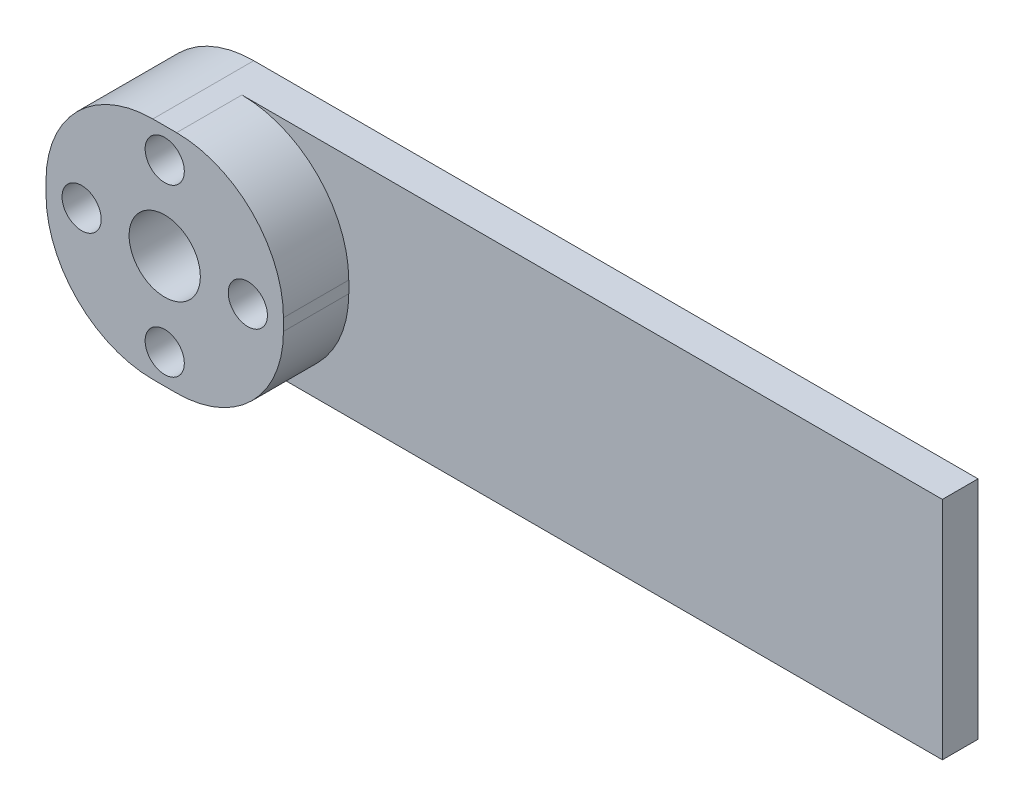
ISO-10303-21;
HEADER;
FILE_DESCRIPTION(('STEP AP214'),'2;1');
FILE_NAME('part.step','',(''),(''),'','','');
FILE_SCHEMA(('AUTOMOTIVE_DESIGN { 1 0 10303 214 1 1 1 1 }'));
ENDSEC;
DATA;
#1=APPLICATION_CONTEXT('core data for automotive mechanical design processes');
#2=APPLICATION_PROTOCOL_DEFINITION('international standard','automotive_design',2000,#1);
#3=PRODUCT_CONTEXT('',#1,'mechanical');
#4=PRODUCT('Part','Part','',(#3));
#5=PRODUCT_RELATED_PRODUCT_CATEGORY('part','',(#4));
#6=PRODUCT_DEFINITION_FORMATION('','',#4);
#7=PRODUCT_DEFINITION_CONTEXT('part definition',#1,'design');
#8=PRODUCT_DEFINITION('design','',#6,#7);
#9=PRODUCT_DEFINITION_SHAPE('','',#8);
#10=(LENGTH_UNIT() NAMED_UNIT(*) SI_UNIT(.MILLI.,.METRE.));
#11=(NAMED_UNIT(*) PLANE_ANGLE_UNIT() SI_UNIT($,.RADIAN.));
#12=(NAMED_UNIT(*) SI_UNIT($,.STERADIAN.) SOLID_ANGLE_UNIT());
#13=UNCERTAINTY_MEASURE_WITH_UNIT(LENGTH_MEASURE(1.E-05),#10,'distance_accuracy_value','');
#14=(GEOMETRIC_REPRESENTATION_CONTEXT(3) GLOBAL_UNCERTAINTY_ASSIGNED_CONTEXT((#13)) GLOBAL_UNIT_ASSIGNED_CONTEXT((#10,
#11,#12)) REPRESENTATION_CONTEXT('',''));
#15=CARTESIAN_POINT('',(0.,0.,0.));
#16=DIRECTION('',(0.,0.,1.));
#17=DIRECTION('',(1.,0.,0.));
#18=AXIS2_PLACEMENT_3D('',#15,#16,#17);
#19=CARTESIAN_POINT('',(0.,9.5,3.));
#20=DIRECTION('',(0.,1.,0.));
#21=DIRECTION('',(0.,0.,1.));
#22=AXIS2_PLACEMENT_3D('',#19,#20,#21);
#23=PLANE('',#22);
#24=DIRECTION('',(-1.,0.,0.));
#25=VECTOR('',#24,1.);
#26=CARTESIAN_POINT('',(-0.999999999999999,9.5,8.5));
#27=LINE('',#26,#25);
#28=CARTESIAN_POINT('',(0.999999999999999,9.5,8.5));
#29=VERTEX_POINT('',#28);
#30=CARTESIAN_POINT('',(-0.999999999999999,9.5,8.5));
#31=VERTEX_POINT('',#30);
#32=EDGE_CURVE('E153',#29,#31,#27,.T.);
#33=ORIENTED_EDGE('',*,*,#32,.F.);
#34=DIRECTION('',(0.,0.,-1.));
#35=VECTOR('',#34,1.);
#36=CARTESIAN_POINT('',(0.999999999999999,9.5,3.));
#37=LINE('',#36,#35);
#38=CARTESIAN_POINT('',(0.999999999999999,9.5,3.));
#39=VERTEX_POINT('',#38);
#40=EDGE_CURVE('E213',#29,#39,#37,.T.);
#41=ORIENTED_EDGE('',*,*,#40,.T.);
#42=DIRECTION('',(1.,0.,0.));
#43=VECTOR('',#42,1.);
#44=CARTESIAN_POINT('',(0.,9.5,3.));
#45=LINE('',#44,#43);
#46=CARTESIAN_POINT('',(60.,9.5,3.));
#47=VERTEX_POINT('',#46);
#48=EDGE_CURVE('E55',#39,#47,#45,.T.);
#49=ORIENTED_EDGE('',*,*,#48,.T.);
#50=DIRECTION('',(0.,0.,-1.));
#51=VECTOR('',#50,1.);
#52=CARTESIAN_POINT('',(60.,9.5,3.));
#53=LINE('',#52,#51);
#54=CARTESIAN_POINT('',(60.,9.5,0.));
#55=VERTEX_POINT('',#54);
#56=EDGE_CURVE('E169',#47,#55,#53,.T.);
#57=ORIENTED_EDGE('',*,*,#56,.T.);
#58=DIRECTION('',(1.,0.,0.));
#59=VECTOR('',#58,1.);
#60=CARTESIAN_POINT('',(0.,9.5,0.));
#61=LINE('',#60,#59);
#62=CARTESIAN_POINT('',(-0.999999999999999,9.5,0.));
#63=VERTEX_POINT('',#62);
#64=EDGE_CURVE('E161',#63,#55,#61,.T.);
#65=ORIENTED_EDGE('',*,*,#64,.F.);
#66=DIRECTION('',(0.,0.,-1.));
#67=VECTOR('',#66,1.);
#68=CARTESIAN_POINT('',(-0.999999999999999,9.5,3.));
#69=LINE('',#68,#67);
#70=EDGE_CURVE('E201',#63,#31,#69,.F.);
#71=ORIENTED_EDGE('',*,*,#70,.T.);
#72=EDGE_LOOP('',(#33,#41,#49,#57,#65,#71));
#73=FACE_BOUND('',#72,.T.);
#74=ADVANCED_FACE('F41',(#73),#23,.T.);
#75=CARTESIAN_POINT('',(-10.,0.,3.));
#76=DIRECTION('',(1.,0.,0.));
#77=DIRECTION('',(0.,0.,-1.));
#78=AXIS2_PLACEMENT_3D('',#75,#76,#77);
#79=PLANE('',#78);
#80=DIRECTION('',(0.,-1.,0.));
#81=VECTOR('',#80,1.);
#82=CARTESIAN_POINT('',(-10.,0.,0.));
#83=LINE('',#82,#81);
#84=CARTESIAN_POINT('',(-10.,0.5,0.));
#85=VERTEX_POINT('',#84);
#86=CARTESIAN_POINT('',(-10.,-0.5,0.));
#87=VERTEX_POINT('',#86);
#88=EDGE_CURVE('E171',#85,#87,#83,.T.);
#89=ORIENTED_EDGE('',*,*,#88,.T.);
#90=DIRECTION('',(0.,0.,-1.));
#91=VECTOR('',#90,1.);
#92=CARTESIAN_POINT('',(-10.,-0.5,3.));
#93=LINE('',#92,#91);
#94=CARTESIAN_POINT('',(-10.,-0.5,8.5));
#95=VERTEX_POINT('',#94);
#96=EDGE_CURVE('E199',#87,#95,#93,.F.);
#97=ORIENTED_EDGE('',*,*,#96,.T.);
#98=DIRECTION('',(0.,-1.,0.));
#99=VECTOR('',#98,1.);
#100=CARTESIAN_POINT('',(-10.,0.5,8.5));
#101=LINE('',#100,#99);
#102=CARTESIAN_POINT('',(-10.,0.5,8.5));
#103=VERTEX_POINT('',#102);
#104=EDGE_CURVE('E143',#103,#95,#101,.T.);
#105=ORIENTED_EDGE('',*,*,#104,.F.);
#106=DIRECTION('',(0.,0.,-1.));
#107=VECTOR('',#106,1.);
#108=CARTESIAN_POINT('',(-10.,0.5,0.));
#109=LINE('',#108,#107);
#110=EDGE_CURVE('E196',#103,#85,#109,.T.);
#111=ORIENTED_EDGE('',*,*,#110,.T.);
#112=EDGE_LOOP('',(#89,#97,#105,#111));
#113=FACE_BOUND('',#112,.T.);
#114=ADVANCED_FACE('F235',(#113),#79,.F.);
#115=CARTESIAN_POINT('',(0.,-9.5,3.));
#116=DIRECTION('',(0.,1.,0.));
#117=DIRECTION('',(0.,0.,1.));
#118=AXIS2_PLACEMENT_3D('',#115,#116,#117);
#119=PLANE('',#118);
#120=DIRECTION('',(1.,0.,0.));
#121=VECTOR('',#120,1.);
#122=CARTESIAN_POINT('',(0.,-9.5,3.));
#123=LINE('',#122,#121);
#124=CARTESIAN_POINT('',(0.999999999999999,-9.5,3.));
#125=VERTEX_POINT('',#124);
#126=CARTESIAN_POINT('',(60.,-9.5,3.));
#127=VERTEX_POINT('',#126);
#128=EDGE_CURVE('E163',#125,#127,#123,.T.);
#129=ORIENTED_EDGE('',*,*,#128,.F.);
#130=DIRECTION('',(0.,0.,-1.));
#131=VECTOR('',#130,1.);
#132=CARTESIAN_POINT('',(0.999999999999999,-9.5,3.));
#133=LINE('',#132,#131);
#134=CARTESIAN_POINT('',(0.999999999999999,-9.5,8.5));
#135=VERTEX_POINT('',#134);
#136=EDGE_CURVE('E134',#125,#135,#133,.F.);
#137=ORIENTED_EDGE('',*,*,#136,.T.);
#138=DIRECTION('',(1.,0.,0.));
#139=VECTOR('',#138,1.);
#140=CARTESIAN_POINT('',(10.,-9.5,8.5));
#141=LINE('',#140,#139);
#142=CARTESIAN_POINT('',(-0.999999999999999,-9.5,8.5));
#143=VERTEX_POINT('',#142);
#144=EDGE_CURVE('E131',#143,#135,#141,.T.);
#145=ORIENTED_EDGE('',*,*,#144,.F.);
#146=DIRECTION('',(0.,0.,-1.));
#147=VECTOR('',#146,1.);
#148=CARTESIAN_POINT('',(-0.999999999999999,-9.5,3.));
#149=LINE('',#148,#147);
#150=CARTESIAN_POINT('',(-0.999999999999999,-9.5,0.));
#151=VERTEX_POINT('',#150);
#152=EDGE_CURVE('E118',#143,#151,#149,.T.);
#153=ORIENTED_EDGE('',*,*,#152,.T.);
#154=DIRECTION('',(1.,0.,0.));
#155=VECTOR('',#154,1.);
#156=CARTESIAN_POINT('',(0.,-9.5,0.));
#157=LINE('',#156,#155);
#158=CARTESIAN_POINT('',(60.,-9.5,0.));
#159=VERTEX_POINT('',#158);
#160=EDGE_CURVE('E174',#151,#159,#157,.T.);
#161=ORIENTED_EDGE('',*,*,#160,.T.);
#162=DIRECTION('',(0.,0.,-1.));
#163=VECTOR('',#162,1.);
#164=CARTESIAN_POINT('',(60.,-9.5,3.));
#165=LINE('',#164,#163);
#166=EDGE_CURVE('E128',#127,#159,#165,.T.);
#167=ORIENTED_EDGE('',*,*,#166,.F.);
#168=EDGE_LOOP('',(#129,#137,#145,#153,#161,#167));
#169=FACE_BOUND('',#168,.T.);
#170=ADVANCED_FACE('F132',(#169),#119,.F.);
#171=CARTESIAN_POINT('',(7.,0.,3.));
#172=DIRECTION('',(0.,0.,-1.));
#173=DIRECTION('',(-1.,0.,0.));
#174=AXIS2_PLACEMENT_3D('',#171,#172,#173);
#175=CYLINDRICAL_SURFACE('',#174,1.65);
#176=CARTESIAN_POINT('',(7.,0.,0.));
#177=DIRECTION('',(0.,0.,1.));
#178=DIRECTION('',(1.,0.,0.));
#179=AXIS2_PLACEMENT_3D('',#176,#177,#178);
#180=CIRCLE('',#179,1.65);
#181=CARTESIAN_POINT('',(8.65,0.,0.));
#182=VERTEX_POINT('',#181);
#183=EDGE_CURVE('E185',#182,#182,#180,.T.);
#184=ORIENTED_EDGE('',*,*,#183,.F.);
#185=EDGE_LOOP('',(#184));
#186=FACE_BOUND('',#185,.T.);
#187=CARTESIAN_POINT('',(7.,0.,8.5));
#188=DIRECTION('',(0.,0.,1.));
#189=DIRECTION('',(1.,0.,0.));
#190=AXIS2_PLACEMENT_3D('',#187,#188,#189);
#191=CIRCLE('',#190,1.65);
#192=CARTESIAN_POINT('',(8.65,0.,8.5));
#193=VERTEX_POINT('',#192);
#194=EDGE_CURVE('E512',#193,#193,#191,.T.);
#195=ORIENTED_EDGE('',*,*,#194,.T.);
#196=EDGE_LOOP('',(#195));
#197=FACE_BOUND('',#196,.T.);
#198=ADVANCED_FACE('F264',(#186,#197),#175,.F.);
#199=CARTESIAN_POINT('',(0.,-7.,3.));
#200=DIRECTION('',(0.,0.,-1.));
#201=DIRECTION('',(-1.,0.,0.));
#202=AXIS2_PLACEMENT_3D('',#199,#200,#201);
#203=CYLINDRICAL_SURFACE('',#202,1.65);
#204=CARTESIAN_POINT('',(0.,-7.,0.));
#205=DIRECTION('',(0.,0.,1.));
#206=DIRECTION('',(1.,0.,0.));
#207=AXIS2_PLACEMENT_3D('',#204,#205,#206);
#208=CIRCLE('',#207,1.65);
#209=CARTESIAN_POINT('',(1.65,-7.,0.));
#210=VERTEX_POINT('',#209);
#211=EDGE_CURVE('E182',#210,#210,#208,.T.);
#212=ORIENTED_EDGE('',*,*,#211,.F.);
#213=EDGE_LOOP('',(#212));
#214=FACE_BOUND('',#213,.T.);
#215=CARTESIAN_POINT('',(0.,-7.,8.5));
#216=DIRECTION('',(0.,0.,1.));
#217=DIRECTION('',(1.,0.,0.));
#218=AXIS2_PLACEMENT_3D('',#215,#216,#217);
#219=CIRCLE('',#218,1.65);
#220=CARTESIAN_POINT('',(1.65,-7.,8.5));
#221=VERTEX_POINT('',#220);
#222=EDGE_CURVE('E511',#221,#221,#219,.T.);
#223=ORIENTED_EDGE('',*,*,#222,.T.);
#224=EDGE_LOOP('',(#223));
#225=FACE_BOUND('',#224,.T.);
#226=ADVANCED_FACE('F271',(#214,#225),#203,.F.);
#227=CARTESIAN_POINT('',(-7.,0.,3.));
#228=DIRECTION('',(0.,0.,-1.));
#229=DIRECTION('',(-1.,0.,0.));
#230=AXIS2_PLACEMENT_3D('',#227,#228,#229);
#231=CYLINDRICAL_SURFACE('',#230,1.65);
#232=CARTESIAN_POINT('',(-7.,0.,0.));
#233=DIRECTION('',(0.,0.,1.));
#234=DIRECTION('',(1.,0.,0.));
#235=AXIS2_PLACEMENT_3D('',#232,#233,#234);
#236=CIRCLE('',#235,1.65);
#237=CARTESIAN_POINT('',(-5.35,0.,0.));
#238=VERTEX_POINT('',#237);
#239=EDGE_CURVE('E179',#238,#238,#236,.T.);
#240=ORIENTED_EDGE('',*,*,#239,.F.);
#241=EDGE_LOOP('',(#240));
#242=FACE_BOUND('',#241,.T.);
#243=CARTESIAN_POINT('',(-7.,0.,8.5));
#244=DIRECTION('',(0.,0.,1.));
#245=DIRECTION('',(1.,0.,0.));
#246=AXIS2_PLACEMENT_3D('',#243,#244,#245);
#247=CIRCLE('',#246,1.65);
#248=CARTESIAN_POINT('',(-5.35,0.,8.5));
#249=VERTEX_POINT('',#248);
#250=EDGE_CURVE('E515',#249,#249,#247,.T.);
#251=ORIENTED_EDGE('',*,*,#250,.T.);
#252=EDGE_LOOP('',(#251));
#253=FACE_BOUND('',#252,.T.);
#254=ADVANCED_FACE('F268',(#242,#253),#231,.F.);
#255=CARTESIAN_POINT('',(60.,0.,3.));
#256=DIRECTION('',(1.,0.,0.));
#257=DIRECTION('',(0.,0.,-1.));
#258=AXIS2_PLACEMENT_3D('',#255,#256,#257);
#259=PLANE('',#258);
#260=DIRECTION('',(0.,-1.,0.));
#261=VECTOR('',#260,1.);
#262=CARTESIAN_POINT('',(60.,0.,0.));
#263=LINE('',#262,#261);
#264=EDGE_CURVE('E176',#55,#159,#263,.T.);
#265=ORIENTED_EDGE('',*,*,#264,.F.);
#266=ORIENTED_EDGE('',*,*,#56,.F.);
#267=DIRECTION('',(0.,-1.,0.));
#268=VECTOR('',#267,1.);
#269=CARTESIAN_POINT('',(60.,0.,3.));
#270=LINE('',#269,#268);
#271=EDGE_CURVE('E166',#47,#127,#270,.T.);
#272=ORIENTED_EDGE('',*,*,#271,.T.);
#273=ORIENTED_EDGE('',*,*,#166,.T.);
#274=EDGE_LOOP('',(#265,#266,#272,#273));
#275=FACE_BOUND('',#274,.T.);
#276=ADVANCED_FACE('F242',(#275),#259,.T.);
#277=CARTESIAN_POINT('',(0.,7.,3.));
#278=DIRECTION('',(0.,0.,-1.));
#279=DIRECTION('',(-1.,0.,0.));
#280=AXIS2_PLACEMENT_3D('',#277,#278,#279);
#281=CYLINDRICAL_SURFACE('',#280,1.65);
#282=CARTESIAN_POINT('',(0.,7.,0.));
#283=DIRECTION('',(0.,0.,1.));
#284=DIRECTION('',(1.,0.,0.));
#285=AXIS2_PLACEMENT_3D('',#282,#283,#284);
#286=CIRCLE('',#285,1.65);
#287=CARTESIAN_POINT('',(1.65,7.,0.));
#288=VERTEX_POINT('',#287);
#289=EDGE_CURVE('E164',#288,#288,#286,.T.);
#290=ORIENTED_EDGE('',*,*,#289,.F.);
#291=EDGE_LOOP('',(#290));
#292=FACE_BOUND('',#291,.T.);
#293=CARTESIAN_POINT('',(0.,7.,8.5));
#294=DIRECTION('',(0.,0.,1.));
#295=DIRECTION('',(1.,0.,0.));
#296=AXIS2_PLACEMENT_3D('',#293,#294,#295);
#297=CIRCLE('',#296,1.65);
#298=CARTESIAN_POINT('',(1.65,7.,8.5));
#299=VERTEX_POINT('',#298);
#300=EDGE_CURVE('E147',#299,#299,#297,.T.);
#301=ORIENTED_EDGE('',*,*,#300,.T.);
#302=EDGE_LOOP('',(#301));
#303=FACE_BOUND('',#302,.T.);
#304=ADVANCED_FACE('F267',(#292,#303),#281,.F.);
#305=CARTESIAN_POINT('',(0.,0.,3.));
#306=DIRECTION('',(0.,0.,1.));
#307=DIRECTION('',(1.,0.,0.));
#308=AXIS2_PLACEMENT_3D('',#305,#306,#307);
#309=PLANE('',#308);
#310=DIRECTION('',(0.,1.,0.));
#311=VECTOR('',#310,1.);
#312=CARTESIAN_POINT('',(10.,9.5,3.));
#313=LINE('',#312,#311);
#314=CARTESIAN_POINT('',(10.,-0.499999999999999,3.));
#315=VERTEX_POINT('',#314);
#316=CARTESIAN_POINT('',(10.,0.500000000000002,3.));
#317=VERTEX_POINT('',#316);
#318=EDGE_CURVE('E144',#315,#317,#313,.T.);
#319=ORIENTED_EDGE('',*,*,#318,.F.);
#320=CARTESIAN_POINT('',(0.999999999999999,-0.5,3.));
#321=DIRECTION('',(0.,0.,1.));
#322=DIRECTION('',(1.,0.,0.));
#323=AXIS2_PLACEMENT_3D('',#320,#321,#322);
#324=CIRCLE('',#323,9.);
#325=EDGE_CURVE('E49',#315,#125,#324,.F.);
#326=ORIENTED_EDGE('',*,*,#325,.T.);
#327=ORIENTED_EDGE('',*,*,#128,.T.);
#328=ORIENTED_EDGE('',*,*,#271,.F.);
#329=ORIENTED_EDGE('',*,*,#48,.F.);
#330=CARTESIAN_POINT('',(0.999999999999999,0.5,3.));
#331=DIRECTION('',(0.,0.,1.));
#332=DIRECTION('',(1.,0.,0.));
#333=AXIS2_PLACEMENT_3D('',#330,#331,#332);
#334=CIRCLE('',#333,9.);
#335=EDGE_CURVE('E11',#39,#317,#334,.F.);
#336=ORIENTED_EDGE('',*,*,#335,.T.);
#337=EDGE_LOOP('',(#319,#326,#327,#328,#329,#336));
#338=FACE_BOUND('',#337,.T.);
#339=ADVANCED_FACE('F217',(#338),#309,.T.);
#340=CARTESIAN_POINT('',(0.,0.,0.));
#341=DIRECTION('',(0.,0.,1.));
#342=DIRECTION('',(1.,0.,0.));
#343=AXIS2_PLACEMENT_3D('',#340,#341,#342);
#344=PLANE('',#343);
#345=CARTESIAN_POINT('',(0.,0.,0.));
#346=DIRECTION('',(0.,0.,1.));
#347=DIRECTION('',(1.,0.,0.));
#348=AXIS2_PLACEMENT_3D('',#345,#346,#347);
#349=CIRCLE('',#348,3.);
#350=CARTESIAN_POINT('',(3.,0.,0.));
#351=VERTEX_POINT('',#350);
#352=EDGE_CURVE('E157',#351,#351,#349,.T.);
#353=ORIENTED_EDGE('',*,*,#352,.T.);
#354=EDGE_LOOP('',(#353));
#355=FACE_BOUND('',#354,.T.);
#356=ORIENTED_EDGE('',*,*,#160,.F.);
#357=CARTESIAN_POINT('',(-0.999999999999999,-0.5,0.));
#358=DIRECTION('',(0.,0.,1.));
#359=DIRECTION('',(1.,0.,0.));
#360=AXIS2_PLACEMENT_3D('',#357,#358,#359);
#361=CIRCLE('',#360,9.);
#362=EDGE_CURVE('E124',#151,#87,#361,.F.);
#363=ORIENTED_EDGE('',*,*,#362,.T.);
#364=ORIENTED_EDGE('',*,*,#88,.F.);
#365=CARTESIAN_POINT('',(-0.999999999999999,0.5,0.));
#366=DIRECTION('',(0.,0.,1.));
#367=DIRECTION('',(1.,0.,0.));
#368=AXIS2_PLACEMENT_3D('',#365,#366,#367);
#369=CIRCLE('',#368,9.);
#370=EDGE_CURVE('E127',#85,#63,#369,.F.);
#371=ORIENTED_EDGE('',*,*,#370,.T.);
#372=ORIENTED_EDGE('',*,*,#64,.T.);
#373=ORIENTED_EDGE('',*,*,#264,.T.);
#374=EDGE_LOOP('',(#356,#363,#364,#371,#372,#373));
#375=FACE_BOUND('',#374,.T.);
#376=ORIENTED_EDGE('',*,*,#239,.T.);
#377=EDGE_LOOP('',(#376));
#378=FACE_BOUND('',#377,.T.);
#379=ORIENTED_EDGE('',*,*,#211,.T.);
#380=EDGE_LOOP('',(#379));
#381=FACE_BOUND('',#380,.T.);
#382=ORIENTED_EDGE('',*,*,#183,.T.);
#383=EDGE_LOOP('',(#382));
#384=FACE_BOUND('',#383,.T.);
#385=ORIENTED_EDGE('',*,*,#289,.T.);
#386=EDGE_LOOP('',(#385));
#387=FACE_BOUND('',#386,.T.);
#388=ADVANCED_FACE('F238',(#355,#375,#378,#381,#384,#387),#344,.F.);
#389=CARTESIAN_POINT('',(0.,0.,0.));
#390=DIRECTION('',(0.,0.,1.));
#391=DIRECTION('',(1.,0.,0.));
#392=AXIS2_PLACEMENT_3D('',#389,#390,#391);
#393=CYLINDRICAL_SURFACE('',#392,3.);
#394=ORIENTED_EDGE('',*,*,#352,.F.);
#395=EDGE_LOOP('',(#394));
#396=FACE_BOUND('',#395,.T.);
#397=CARTESIAN_POINT('',(0.,0.,8.5));
#398=DIRECTION('',(0.,0.,1.));
#399=DIRECTION('',(1.,0.,0.));
#400=AXIS2_PLACEMENT_3D('',#397,#398,#399);
#401=CIRCLE('',#400,3.);
#402=CARTESIAN_POINT('',(3.,0.,8.5));
#403=VERTEX_POINT('',#402);
#404=EDGE_CURVE('E510',#403,#403,#401,.T.);
#405=ORIENTED_EDGE('',*,*,#404,.T.);
#406=EDGE_LOOP('',(#405));
#407=FACE_BOUND('',#406,.T.);
#408=ADVANCED_FACE('F252',(#396,#407),#393,.F.);
#409=CARTESIAN_POINT('',(-0.999999999999999,-0.5,3.));
#410=DIRECTION('',(0.,0.,-1.));
#411=DIRECTION('',(-1.,0.,0.));
#412=AXIS2_PLACEMENT_3D('',#409,#410,#411);
#413=CYLINDRICAL_SURFACE('',#412,9.);
#414=ORIENTED_EDGE('',*,*,#152,.F.);
#415=CARTESIAN_POINT('',(-0.999999999999999,-0.5,8.5));
#416=DIRECTION('',(0.,0.,1.));
#417=DIRECTION('',(1.,0.,0.));
#418=AXIS2_PLACEMENT_3D('',#415,#416,#417);
#419=CIRCLE('',#418,9.);
#420=EDGE_CURVE('E123',#95,#143,#419,.T.);
#421=ORIENTED_EDGE('',*,*,#420,.F.);
#422=ORIENTED_EDGE('',*,*,#96,.F.);
#423=ORIENTED_EDGE('',*,*,#362,.F.);
#424=EDGE_LOOP('',(#414,#421,#422,#423));
#425=FACE_BOUND('',#424,.T.);
#426=ADVANCED_FACE('F120',(#425),#413,.T.);
#427=CARTESIAN_POINT('',(-0.999999999999999,0.5,3.));
#428=DIRECTION('',(0.,0.,1.));
#429=DIRECTION('',(1.,0.,0.));
#430=AXIS2_PLACEMENT_3D('',#427,#428,#429);
#431=CYLINDRICAL_SURFACE('',#430,9.);
#432=ORIENTED_EDGE('',*,*,#110,.F.);
#433=CARTESIAN_POINT('',(-0.999999999999999,0.5,8.5));
#434=DIRECTION('',(0.,0.,1.));
#435=DIRECTION('',(1.,0.,0.));
#436=AXIS2_PLACEMENT_3D('',#433,#434,#435);
#437=CIRCLE('',#436,9.);
#438=EDGE_CURVE('E155',#31,#103,#437,.T.);
#439=ORIENTED_EDGE('',*,*,#438,.F.);
#440=ORIENTED_EDGE('',*,*,#70,.F.);
#441=ORIENTED_EDGE('',*,*,#370,.F.);
#442=EDGE_LOOP('',(#432,#439,#440,#441));
#443=FACE_BOUND('',#442,.T.);
#444=ADVANCED_FACE('F243',(#443),#431,.T.);
#445=CARTESIAN_POINT('',(-0.999999999999999,-0.5,8.5));
#446=DIRECTION('',(0.,0.,1.));
#447=DIRECTION('',(1.,0.,0.));
#448=AXIS2_PLACEMENT_3D('',#445,#446,#447);
#449=PLANE('',#448);
#450=ORIENTED_EDGE('',*,*,#404,.F.);
#451=EDGE_LOOP('',(#450));
#452=FACE_BOUND('',#451,.T.);
#453=ORIENTED_EDGE('',*,*,#250,.F.);
#454=EDGE_LOOP('',(#453));
#455=FACE_BOUND('',#454,.T.);
#456=ORIENTED_EDGE('',*,*,#144,.T.);
#457=CARTESIAN_POINT('',(0.999999999999999,-0.5,8.5));
#458=DIRECTION('',(0.,0.,1.));
#459=DIRECTION('',(1.,0.,0.));
#460=AXIS2_PLACEMENT_3D('',#457,#458,#459);
#461=CIRCLE('',#460,9.);
#462=CARTESIAN_POINT('',(10.,-0.499999999999999,8.5));
#463=VERTEX_POINT('',#462);
#464=EDGE_CURVE('E211',#135,#463,#461,.T.);
#465=ORIENTED_EDGE('',*,*,#464,.T.);
#466=DIRECTION('',(0.,1.,0.));
#467=VECTOR('',#466,1.);
#468=CARTESIAN_POINT('',(10.,9.5,8.5));
#469=LINE('',#468,#467);
#470=CARTESIAN_POINT('',(10.,0.500000000000002,8.5));
#471=VERTEX_POINT('',#470);
#472=EDGE_CURVE('E136',#463,#471,#469,.T.);
#473=ORIENTED_EDGE('',*,*,#472,.T.);
#474=CARTESIAN_POINT('',(0.999999999999999,0.5,8.5));
#475=DIRECTION('',(0.,0.,1.));
#476=DIRECTION('',(1.,0.,0.));
#477=AXIS2_PLACEMENT_3D('',#474,#475,#476);
#478=CIRCLE('',#477,9.);
#479=EDGE_CURVE('E63',#471,#29,#478,.T.);
#480=ORIENTED_EDGE('',*,*,#479,.T.);
#481=ORIENTED_EDGE('',*,*,#32,.T.);
#482=ORIENTED_EDGE('',*,*,#438,.T.);
#483=ORIENTED_EDGE('',*,*,#104,.T.);
#484=ORIENTED_EDGE('',*,*,#420,.T.);
#485=EDGE_LOOP('',(#456,#465,#473,#480,#481,#482,#483,#484));
#486=FACE_BOUND('',#485,.T.);
#487=ORIENTED_EDGE('',*,*,#300,.F.);
#488=EDGE_LOOP('',(#487));
#489=FACE_BOUND('',#488,.T.);
#490=ORIENTED_EDGE('',*,*,#222,.F.);
#491=EDGE_LOOP('',(#490));
#492=FACE_BOUND('',#491,.T.);
#493=ORIENTED_EDGE('',*,*,#194,.F.);
#494=EDGE_LOOP('',(#493));
#495=FACE_BOUND('',#494,.T.);
#496=ADVANCED_FACE('F139',(#452,#455,#486,#489,#492,#495),#449,.T.);
#497=CARTESIAN_POINT('',(10.,9.5,8.5));
#498=DIRECTION('',(-1.,0.,0.));
#499=DIRECTION('',(0.,-1.,0.));
#500=AXIS2_PLACEMENT_3D('',#497,#498,#499);
#501=PLANE('',#500);
#502=ORIENTED_EDGE('',*,*,#472,.F.);
#503=DIRECTION('',(0.,0.,-1.));
#504=VECTOR('',#503,1.);
#505=CARTESIAN_POINT('',(10.,-0.499999999999999,8.5));
#506=LINE('',#505,#504);
#507=EDGE_CURVE('E206',#463,#315,#506,.T.);
#508=ORIENTED_EDGE('',*,*,#507,.T.);
#509=ORIENTED_EDGE('',*,*,#318,.T.);
#510=DIRECTION('',(0.,0.,-1.));
#511=VECTOR('',#510,1.);
#512=CARTESIAN_POINT('',(10.,0.500000000000002,8.5));
#513=LINE('',#512,#511);
#514=EDGE_CURVE('E204',#317,#471,#513,.F.);
#515=ORIENTED_EDGE('',*,*,#514,.T.);
#516=EDGE_LOOP('',(#502,#508,#509,#515));
#517=FACE_BOUND('',#516,.T.);
#518=ADVANCED_FACE('F224',(#517),#501,.F.);
#519=CARTESIAN_POINT('',(0.999999999999999,-0.5,8.5));
#520=DIRECTION('',(0.,0.,-1.));
#521=DIRECTION('',(-1.,0.,0.));
#522=AXIS2_PLACEMENT_3D('',#519,#520,#521);
#523=CYLINDRICAL_SURFACE('',#522,9.);
#524=ORIENTED_EDGE('',*,*,#464,.F.);
#525=ORIENTED_EDGE('',*,*,#136,.F.);
#526=ORIENTED_EDGE('',*,*,#325,.F.);
#527=ORIENTED_EDGE('',*,*,#507,.F.);
#528=EDGE_LOOP('',(#524,#525,#526,#527));
#529=FACE_BOUND('',#528,.T.);
#530=ADVANCED_FACE('F221',(#529),#523,.T.);
#531=CARTESIAN_POINT('',(0.999999999999999,0.5,3.));
#532=DIRECTION('',(0.,0.,1.));
#533=DIRECTION('',(1.,0.,0.));
#534=AXIS2_PLACEMENT_3D('',#531,#532,#533);
#535=CYLINDRICAL_SURFACE('',#534,9.);
#536=ORIENTED_EDGE('',*,*,#479,.F.);
#537=ORIENTED_EDGE('',*,*,#514,.F.);
#538=ORIENTED_EDGE('',*,*,#335,.F.);
#539=ORIENTED_EDGE('',*,*,#40,.F.);
#540=EDGE_LOOP('',(#536,#537,#538,#539));
#541=FACE_BOUND('',#540,.T.);
#542=ADVANCED_FACE('F43',(#541),#535,.T.);
#543=CLOSED_SHELL('',(#74,#114,#170,#198,#226,#254,#276,#304,#339,#388,#408,#426,#444,#496,#518,
#530,#542));
#544=MANIFOLD_SOLID_BREP('B2',#543);
#545=ADVANCED_BREP_SHAPE_REPRESENTATION('',(#18,#544),#14);
#546=SHAPE_DEFINITION_REPRESENTATION(#9,#545);
ENDSEC;
END-ISO-10303-21;
